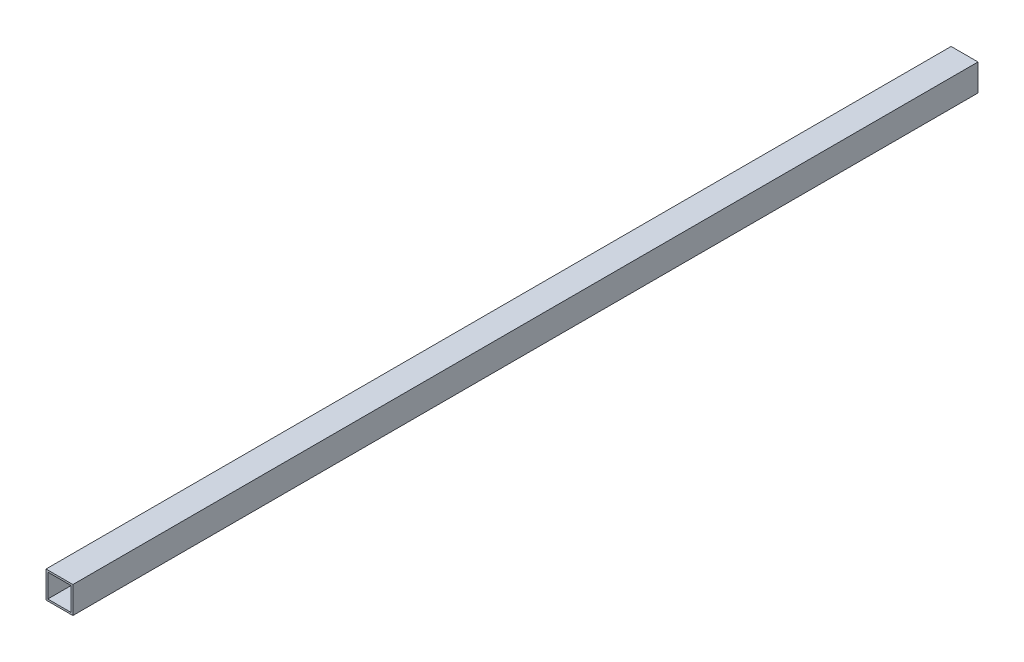
ISO-10303-21;
HEADER;
FILE_DESCRIPTION(('STEP AP214'),'2;1');
FILE_NAME('part.step','',(''),(''),'','','');
FILE_SCHEMA(('AUTOMOTIVE_DESIGN { 1 0 10303 214 1 1 1 1 }'));
ENDSEC;
DATA;
#1=APPLICATION_CONTEXT('core data for automotive mechanical design processes');
#2=APPLICATION_PROTOCOL_DEFINITION('international standard','automotive_design',2000,#1);
#3=PRODUCT_CONTEXT('',#1,'mechanical');
#4=PRODUCT('Part','Part','',(#3));
#5=PRODUCT_RELATED_PRODUCT_CATEGORY('part','',(#4));
#6=PRODUCT_DEFINITION_FORMATION('','',#4);
#7=PRODUCT_DEFINITION_CONTEXT('part definition',#1,'design');
#8=PRODUCT_DEFINITION('design','',#6,#7);
#9=PRODUCT_DEFINITION_SHAPE('','',#8);
#10=(LENGTH_UNIT() NAMED_UNIT(*) SI_UNIT(.MILLI.,.METRE.));
#11=(NAMED_UNIT(*) PLANE_ANGLE_UNIT() SI_UNIT($,.RADIAN.));
#12=(NAMED_UNIT(*) SI_UNIT($,.STERADIAN.) SOLID_ANGLE_UNIT());
#13=UNCERTAINTY_MEASURE_WITH_UNIT(LENGTH_MEASURE(1.E-05),#10,'distance_accuracy_value','');
#14=(GEOMETRIC_REPRESENTATION_CONTEXT(3) GLOBAL_UNCERTAINTY_ASSIGNED_CONTEXT((#13)) GLOBAL_UNIT_ASSIGNED_CONTEXT((#10,
#11,#12)) REPRESENTATION_CONTEXT('',''));
#15=CARTESIAN_POINT('',(0.,0.,0.));
#16=DIRECTION('',(0.,0.,1.));
#17=DIRECTION('',(1.,0.,0.));
#18=AXIS2_PLACEMENT_3D('',#15,#16,#17);
#19=CARTESIAN_POINT('',(-15.,-15.,1010.));
#20=DIRECTION('',(0.,0.,1.));
#21=DIRECTION('',(1.,0.,0.));
#22=AXIS2_PLACEMENT_3D('',#19,#20,#21);
#23=PLANE('',#22);
#24=DIRECTION('',(0.,-1.,0.));
#25=VECTOR('',#24,1.);
#26=CARTESIAN_POINT('',(-15.,-15.,1010.));
#27=LINE('',#26,#25);
#28=CARTESIAN_POINT('',(-15.,15.,1010.));
#29=VERTEX_POINT('',#28);
#30=CARTESIAN_POINT('',(-15.,-15.,1010.));
#31=VERTEX_POINT('',#30);
#32=EDGE_CURVE('E160',#29,#31,#27,.T.);
#33=ORIENTED_EDGE('',*,*,#32,.T.);
#34=DIRECTION('',(1.,0.,0.));
#35=VECTOR('',#34,1.);
#36=CARTESIAN_POINT('',(15.,-15.,1010.));
#37=LINE('',#36,#35);
#38=CARTESIAN_POINT('',(15.,-15.,1010.));
#39=VERTEX_POINT('',#38);
#40=EDGE_CURVE('E163',#31,#39,#37,.T.);
#41=ORIENTED_EDGE('',*,*,#40,.T.);
#42=DIRECTION('',(0.,1.,0.));
#43=VECTOR('',#42,1.);
#44=CARTESIAN_POINT('',(15.,-15.,1010.));
#45=LINE('',#44,#43);
#46=CARTESIAN_POINT('',(15.,15.,1010.));
#47=VERTEX_POINT('',#46);
#48=EDGE_CURVE('E166',#39,#47,#45,.T.);
#49=ORIENTED_EDGE('',*,*,#48,.T.);
#50=DIRECTION('',(-1.,0.,0.));
#51=VECTOR('',#50,1.);
#52=CARTESIAN_POINT('',(15.,15.,1010.));
#53=LINE('',#52,#51);
#54=EDGE_CURVE('E168',#47,#29,#53,.T.);
#55=ORIENTED_EDGE('',*,*,#54,.T.);
#56=EDGE_LOOP('',(#33,#41,#49,#55));
#57=FACE_BOUND('',#56,.T.);
#58=DIRECTION('',(1.,0.,0.));
#59=VECTOR('',#58,1.);
#60=CARTESIAN_POINT('',(15.,-13.,1010.));
#61=LINE('',#60,#59);
#62=CARTESIAN_POINT('',(-13.,-13.,1010.));
#63=VERTEX_POINT('',#62);
#64=CARTESIAN_POINT('',(13.,-13.,1010.));
#65=VERTEX_POINT('',#64);
#66=EDGE_CURVE('E132',#63,#65,#61,.T.);
#67=ORIENTED_EDGE('',*,*,#66,.F.);
#68=DIRECTION('',(0.,-1.,0.));
#69=VECTOR('',#68,1.);
#70=CARTESIAN_POINT('',(-13.,-15.,1010.));
#71=LINE('',#70,#69);
#72=CARTESIAN_POINT('',(-13.,13.,1010.));
#73=VERTEX_POINT('',#72);
#74=EDGE_CURVE('E124',#73,#63,#71,.T.);
#75=ORIENTED_EDGE('',*,*,#74,.F.);
#76=DIRECTION('',(-1.,0.,0.));
#77=VECTOR('',#76,1.);
#78=CARTESIAN_POINT('',(15.,13.,1010.));
#79=LINE('',#78,#77);
#80=CARTESIAN_POINT('',(13.,13.,1010.));
#81=VERTEX_POINT('',#80);
#82=EDGE_CURVE('E146',#81,#73,#79,.T.);
#83=ORIENTED_EDGE('',*,*,#82,.F.);
#84=DIRECTION('',(0.,1.,0.));
#85=VECTOR('',#84,1.);
#86=CARTESIAN_POINT('',(13.,-15.,1010.));
#87=LINE('',#86,#85);
#88=EDGE_CURVE('E144',#65,#81,#87,.T.);
#89=ORIENTED_EDGE('',*,*,#88,.F.);
#90=EDGE_LOOP('',(#67,#75,#83,#89));
#91=FACE_BOUND('',#90,.T.);
#92=ADVANCED_FACE('F59',(#57,#91),#23,.T.);
#93=CARTESIAN_POINT('',(-15.,-15.,0.));
#94=DIRECTION('',(0.,0.,1.));
#95=DIRECTION('',(1.,0.,0.));
#96=AXIS2_PLACEMENT_3D('',#93,#94,#95);
#97=PLANE('',#96);
#98=DIRECTION('',(0.,-1.,0.));
#99=VECTOR('',#98,1.);
#100=CARTESIAN_POINT('',(-15.,-15.,0.));
#101=LINE('',#100,#99);
#102=CARTESIAN_POINT('',(-15.,15.,0.));
#103=VERTEX_POINT('',#102);
#104=CARTESIAN_POINT('',(-15.,-15.,0.));
#105=VERTEX_POINT('',#104);
#106=EDGE_CURVE('E140',#103,#105,#101,.T.);
#107=ORIENTED_EDGE('',*,*,#106,.F.);
#108=DIRECTION('',(-1.,0.,0.));
#109=VECTOR('',#108,1.);
#110=CARTESIAN_POINT('',(15.,15.,0.));
#111=LINE('',#110,#109);
#112=CARTESIAN_POINT('',(15.,15.,0.));
#113=VERTEX_POINT('',#112);
#114=EDGE_CURVE('E164',#113,#103,#111,.T.);
#115=ORIENTED_EDGE('',*,*,#114,.F.);
#116=DIRECTION('',(0.,1.,0.));
#117=VECTOR('',#116,1.);
#118=CARTESIAN_POINT('',(15.,-15.,0.));
#119=LINE('',#118,#117);
#120=CARTESIAN_POINT('',(15.,-15.,0.));
#121=VERTEX_POINT('',#120);
#122=EDGE_CURVE('E175',#121,#113,#119,.T.);
#123=ORIENTED_EDGE('',*,*,#122,.F.);
#124=DIRECTION('',(1.,0.,0.));
#125=VECTOR('',#124,1.);
#126=CARTESIAN_POINT('',(15.,-15.,0.));
#127=LINE('',#126,#125);
#128=EDGE_CURVE('E173',#105,#121,#127,.T.);
#129=ORIENTED_EDGE('',*,*,#128,.F.);
#130=EDGE_LOOP('',(#107,#115,#123,#129));
#131=FACE_BOUND('',#130,.T.);
#132=DIRECTION('',(0.,-1.,0.));
#133=VECTOR('',#132,1.);
#134=CARTESIAN_POINT('',(-13.,-15.,0.));
#135=LINE('',#134,#133);
#136=CARTESIAN_POINT('',(-13.,13.,0.));
#137=VERTEX_POINT('',#136);
#138=CARTESIAN_POINT('',(-13.,-13.,0.));
#139=VERTEX_POINT('',#138);
#140=EDGE_CURVE('E82',#137,#139,#135,.T.);
#141=ORIENTED_EDGE('',*,*,#140,.T.);
#142=DIRECTION('',(1.,0.,0.));
#143=VECTOR('',#142,1.);
#144=CARTESIAN_POINT('',(15.,-13.,0.));
#145=LINE('',#144,#143);
#146=CARTESIAN_POINT('',(13.,-13.,0.));
#147=VERTEX_POINT('',#146);
#148=EDGE_CURVE('E139',#139,#147,#145,.T.);
#149=ORIENTED_EDGE('',*,*,#148,.T.);
#150=DIRECTION('',(0.,1.,0.));
#151=VECTOR('',#150,1.);
#152=CARTESIAN_POINT('',(13.,-15.,0.));
#153=LINE('',#152,#151);
#154=CARTESIAN_POINT('',(13.,13.,0.));
#155=VERTEX_POINT('',#154);
#156=EDGE_CURVE('E152',#147,#155,#153,.T.);
#157=ORIENTED_EDGE('',*,*,#156,.T.);
#158=DIRECTION('',(-1.,0.,0.));
#159=VECTOR('',#158,1.);
#160=CARTESIAN_POINT('',(15.,13.,0.));
#161=LINE('',#160,#159);
#162=EDGE_CURVE('E133',#155,#137,#161,.T.);
#163=ORIENTED_EDGE('',*,*,#162,.T.);
#164=EDGE_LOOP('',(#141,#149,#157,#163));
#165=FACE_BOUND('',#164,.T.);
#166=ADVANCED_FACE('F193',(#131,#165),#97,.F.);
#167=CARTESIAN_POINT('',(-15.,-15.,1010.));
#168=DIRECTION('',(1.,0.,0.));
#169=DIRECTION('',(0.,0.,-1.));
#170=AXIS2_PLACEMENT_3D('',#167,#168,#169);
#171=PLANE('',#170);
#172=ORIENTED_EDGE('',*,*,#106,.T.);
#173=DIRECTION('',(0.,0.,-1.));
#174=VECTOR('',#173,1.);
#175=CARTESIAN_POINT('',(-15.,-15.,1010.));
#176=LINE('',#175,#174);
#177=EDGE_CURVE('E12',#31,#105,#176,.T.);
#178=ORIENTED_EDGE('',*,*,#177,.F.);
#179=ORIENTED_EDGE('',*,*,#32,.F.);
#180=DIRECTION('',(0.,0.,-1.));
#181=VECTOR('',#180,1.);
#182=CARTESIAN_POINT('',(-15.,15.,1010.));
#183=LINE('',#182,#181);
#184=EDGE_CURVE('E170',#29,#103,#183,.T.);
#185=ORIENTED_EDGE('',*,*,#184,.T.);
#186=EDGE_LOOP('',(#172,#178,#179,#185));
#187=FACE_BOUND('',#186,.T.);
#188=ADVANCED_FACE('F61',(#187),#171,.F.);
#189=CARTESIAN_POINT('',(15.,-15.,1010.));
#190=DIRECTION('',(0.,1.,0.));
#191=DIRECTION('',(-1.,0.,0.));
#192=AXIS2_PLACEMENT_3D('',#189,#190,#191);
#193=PLANE('',#192);
#194=ORIENTED_EDGE('',*,*,#128,.T.);
#195=DIRECTION('',(0.,0.,-1.));
#196=VECTOR('',#195,1.);
#197=CARTESIAN_POINT('',(15.,-15.,1010.));
#198=LINE('',#197,#196);
#199=EDGE_CURVE('E67',#39,#121,#198,.T.);
#200=ORIENTED_EDGE('',*,*,#199,.F.);
#201=ORIENTED_EDGE('',*,*,#40,.F.);
#202=ORIENTED_EDGE('',*,*,#177,.T.);
#203=EDGE_LOOP('',(#194,#200,#201,#202));
#204=FACE_BOUND('',#203,.T.);
#205=ADVANCED_FACE('F203',(#204),#193,.F.);
#206=CARTESIAN_POINT('',(15.,-15.,1010.));
#207=DIRECTION('',(-1.,0.,0.));
#208=DIRECTION('',(0.,0.,1.));
#209=AXIS2_PLACEMENT_3D('',#206,#207,#208);
#210=PLANE('',#209);
#211=ORIENTED_EDGE('',*,*,#122,.T.);
#212=DIRECTION('',(0.,0.,-1.));
#213=VECTOR('',#212,1.);
#214=CARTESIAN_POINT('',(15.,15.,1010.));
#215=LINE('',#214,#213);
#216=EDGE_CURVE('E180',#47,#113,#215,.T.);
#217=ORIENTED_EDGE('',*,*,#216,.F.);
#218=ORIENTED_EDGE('',*,*,#48,.F.);
#219=ORIENTED_EDGE('',*,*,#199,.T.);
#220=EDGE_LOOP('',(#211,#217,#218,#219));
#221=FACE_BOUND('',#220,.T.);
#222=ADVANCED_FACE('F187',(#221),#210,.F.);
#223=CARTESIAN_POINT('',(15.,15.,1010.));
#224=DIRECTION('',(0.,-1.,0.));
#225=DIRECTION('',(1.,0.,0.));
#226=AXIS2_PLACEMENT_3D('',#223,#224,#225);
#227=PLANE('',#226);
#228=ORIENTED_EDGE('',*,*,#114,.T.);
#229=ORIENTED_EDGE('',*,*,#184,.F.);
#230=ORIENTED_EDGE('',*,*,#54,.F.);
#231=ORIENTED_EDGE('',*,*,#216,.T.);
#232=EDGE_LOOP('',(#228,#229,#230,#231));
#233=FACE_BOUND('',#232,.T.);
#234=ADVANCED_FACE('F197',(#233),#227,.F.);
#235=CARTESIAN_POINT('',(-13.,-15.,1010.));
#236=DIRECTION('',(1.,0.,0.));
#237=DIRECTION('',(0.,0.,-1.));
#238=AXIS2_PLACEMENT_3D('',#235,#236,#237);
#239=PLANE('',#238);
#240=ORIENTED_EDGE('',*,*,#140,.F.);
#241=DIRECTION('',(0.,0.,-1.));
#242=VECTOR('',#241,1.);
#243=CARTESIAN_POINT('',(-13.,13.,1010.));
#244=LINE('',#243,#242);
#245=EDGE_CURVE('E128',#73,#137,#244,.T.);
#246=ORIENTED_EDGE('',*,*,#245,.F.);
#247=ORIENTED_EDGE('',*,*,#74,.T.);
#248=DIRECTION('',(0.,0.,-1.));
#249=VECTOR('',#248,1.);
#250=CARTESIAN_POINT('',(-13.,-13.,1010.));
#251=LINE('',#250,#249);
#252=EDGE_CURVE('E127',#63,#139,#251,.T.);
#253=ORIENTED_EDGE('',*,*,#252,.T.);
#254=EDGE_LOOP('',(#240,#246,#247,#253));
#255=FACE_BOUND('',#254,.T.);
#256=ADVANCED_FACE('F126',(#255),#239,.T.);
#257=CARTESIAN_POINT('',(15.,-13.,1010.));
#258=DIRECTION('',(0.,1.,0.));
#259=DIRECTION('',(-1.,0.,0.));
#260=AXIS2_PLACEMENT_3D('',#257,#258,#259);
#261=PLANE('',#260);
#262=ORIENTED_EDGE('',*,*,#148,.F.);
#263=ORIENTED_EDGE('',*,*,#252,.F.);
#264=ORIENTED_EDGE('',*,*,#66,.T.);
#265=DIRECTION('',(0.,0.,-1.));
#266=VECTOR('',#265,1.);
#267=CARTESIAN_POINT('',(13.,-13.,1010.));
#268=LINE('',#267,#266);
#269=EDGE_CURVE('E141',#65,#147,#268,.T.);
#270=ORIENTED_EDGE('',*,*,#269,.T.);
#271=EDGE_LOOP('',(#262,#263,#264,#270));
#272=FACE_BOUND('',#271,.T.);
#273=ADVANCED_FACE('F136',(#272),#261,.T.);
#274=CARTESIAN_POINT('',(13.,-15.,1010.));
#275=DIRECTION('',(-1.,0.,0.));
#276=DIRECTION('',(0.,0.,1.));
#277=AXIS2_PLACEMENT_3D('',#274,#275,#276);
#278=PLANE('',#277);
#279=ORIENTED_EDGE('',*,*,#156,.F.);
#280=ORIENTED_EDGE('',*,*,#269,.F.);
#281=ORIENTED_EDGE('',*,*,#88,.T.);
#282=DIRECTION('',(0.,0.,-1.));
#283=VECTOR('',#282,1.);
#284=CARTESIAN_POINT('',(13.,13.,1010.));
#285=LINE('',#284,#283);
#286=EDGE_CURVE('E74',#81,#155,#285,.T.);
#287=ORIENTED_EDGE('',*,*,#286,.T.);
#288=EDGE_LOOP('',(#279,#280,#281,#287));
#289=FACE_BOUND('',#288,.T.);
#290=ADVANCED_FACE('F226',(#289),#278,.T.);
#291=CARTESIAN_POINT('',(15.,13.,1010.));
#292=DIRECTION('',(0.,-1.,0.));
#293=DIRECTION('',(1.,0.,0.));
#294=AXIS2_PLACEMENT_3D('',#291,#292,#293);
#295=PLANE('',#294);
#296=ORIENTED_EDGE('',*,*,#162,.F.);
#297=ORIENTED_EDGE('',*,*,#286,.F.);
#298=ORIENTED_EDGE('',*,*,#82,.T.);
#299=ORIENTED_EDGE('',*,*,#245,.T.);
#300=EDGE_LOOP('',(#296,#297,#298,#299));
#301=FACE_BOUND('',#300,.T.);
#302=ADVANCED_FACE('F230',(#301),#295,.T.);
#303=CLOSED_SHELL('',(#92,#166,#188,#205,#222,#234,#256,#273,#290,#302));
#304=MANIFOLD_SOLID_BREP('B2',#303);
#305=ADVANCED_BREP_SHAPE_REPRESENTATION('',(#18,#304),#14);
#306=SHAPE_DEFINITION_REPRESENTATION(#9,#305);
ENDSEC;
END-ISO-10303-21;
